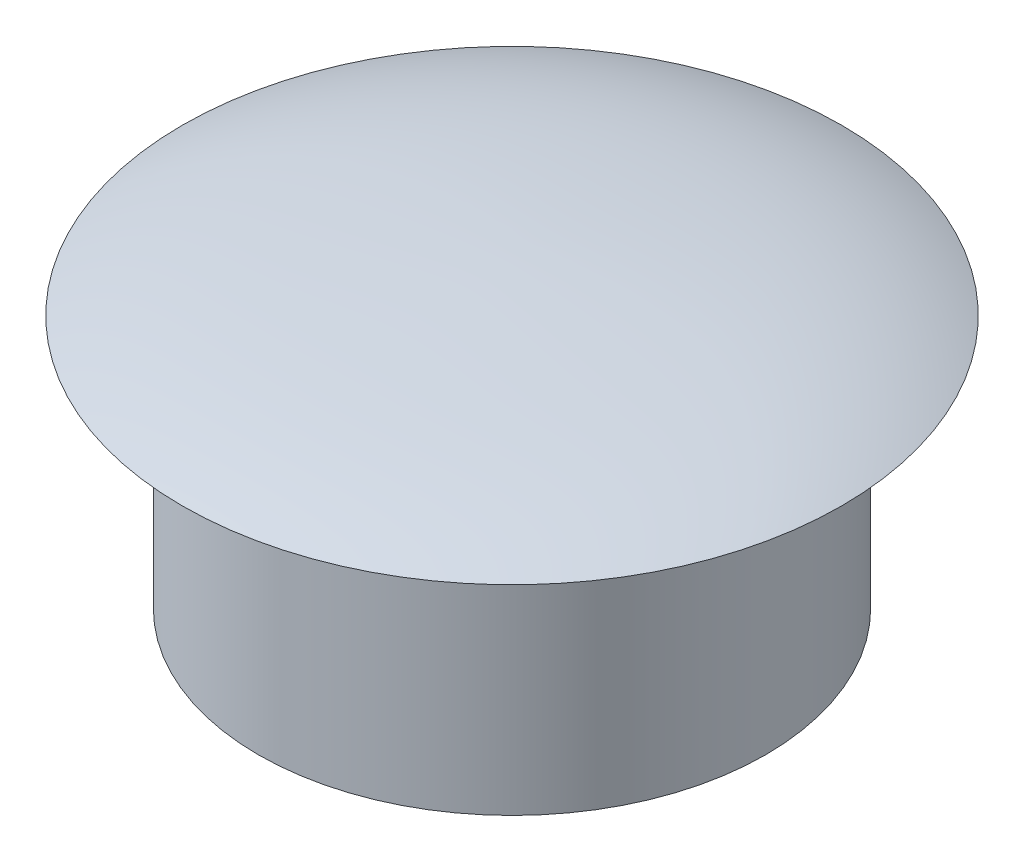
ISO-10303-21;
HEADER;
FILE_DESCRIPTION(('STEP AP214'),'2;1');
FILE_NAME('part.step','',(''),(''),'','','');
FILE_SCHEMA(('AUTOMOTIVE_DESIGN { 1 0 10303 214 1 1 1 1 }'));
ENDSEC;
DATA;
#1=APPLICATION_CONTEXT('core data for automotive mechanical design processes');
#2=APPLICATION_PROTOCOL_DEFINITION('international standard','automotive_design',2000,#1);
#3=PRODUCT_CONTEXT('',#1,'mechanical');
#4=PRODUCT('Part','Part','',(#3));
#5=PRODUCT_RELATED_PRODUCT_CATEGORY('part','',(#4));
#6=PRODUCT_DEFINITION_FORMATION('','',#4);
#7=PRODUCT_DEFINITION_CONTEXT('part definition',#1,'design');
#8=PRODUCT_DEFINITION('design','',#6,#7);
#9=PRODUCT_DEFINITION_SHAPE('','',#8);
#10=(LENGTH_UNIT() NAMED_UNIT(*) SI_UNIT(.MILLI.,.METRE.));
#11=(NAMED_UNIT(*) PLANE_ANGLE_UNIT() SI_UNIT($,.RADIAN.));
#12=(NAMED_UNIT(*) SI_UNIT($,.STERADIAN.) SOLID_ANGLE_UNIT());
#13=UNCERTAINTY_MEASURE_WITH_UNIT(LENGTH_MEASURE(1.E-05),#10,'distance_accuracy_value','');
#14=(GEOMETRIC_REPRESENTATION_CONTEXT(3) GLOBAL_UNCERTAINTY_ASSIGNED_CONTEXT((#13)) GLOBAL_UNIT_ASSIGNED_CONTEXT((#10,
#11,#12)) REPRESENTATION_CONTEXT('',''));
#15=CARTESIAN_POINT('',(0.,0.,0.));
#16=DIRECTION('',(0.,0.,1.));
#17=DIRECTION('',(1.,0.,0.));
#18=AXIS2_PLACEMENT_3D('',#15,#16,#17);
#19=CARTESIAN_POINT('',(-0.247747680903639,15.512478323168,0.));
#20=DIRECTION('',(0.,1.,0.));
#21=DIRECTION('',(-1.,0.,0.));
#22=AXIS2_PLACEMENT_3D('',#19,#20,#21);
#23=CYLINDRICAL_SURFACE('',#22,5.);
#24=CARTESIAN_POINT('',(-0.247747680903636,9.57512824739122,0.));
#25=DIRECTION('',(0.,1.,0.));
#26=DIRECTION('',(-1.,0.,0.));
#27=AXIS2_PLACEMENT_3D('',#24,#25,#26);
#28=CIRCLE('',#27,5.);
#29=CARTESIAN_POINT('',(-5.24774768090364,9.57512824739122,0.));
#30=VERTEX_POINT('',#29);
#31=EDGE_CURVE('E11',#30,#30,#28,.T.);
#32=ORIENTED_EDGE('',*,*,#31,.T.);
#33=EDGE_LOOP('',(#32));
#34=FACE_BOUND('',#33,.T.);
#35=CARTESIAN_POINT('',(-0.247747680903638,14.5751282473912,0.));
#36=DIRECTION('',(0.,1.,0.));
#37=DIRECTION('',(-1.,0.,0.));
#38=AXIS2_PLACEMENT_3D('',#35,#36,#37);
#39=CIRCLE('',#38,5.);
#40=CARTESIAN_POINT('',(-5.24774768090364,14.5751282473912,0.));
#41=VERTEX_POINT('',#40);
#42=EDGE_CURVE('E75',#41,#41,#39,.T.);
#43=ORIENTED_EDGE('',*,*,#42,.F.);
#44=EDGE_LOOP('',(#43));
#45=FACE_BOUND('',#44,.T.);
#46=ADVANCED_FACE('F36',(#34,#45),#23,.T.);
#47=CARTESIAN_POINT('',(-4.24774768090364,9.57512824739122,0.));
#48=DIRECTION('',(0.,-1.,0.));
#49=DIRECTION('',(1.,0.,0.));
#50=AXIS2_PLACEMENT_3D('',#47,#48,#49);
#51=PLANE('',#50);
#52=CARTESIAN_POINT('',(-0.247747680903636,9.57512824739122,0.));
#53=DIRECTION('',(0.,1.,0.));
#54=DIRECTION('',(-1.,0.,0.));
#55=AXIS2_PLACEMENT_3D('',#52,#53,#54);
#56=CIRCLE('',#55,4.);
#57=CARTESIAN_POINT('',(-4.24774768090364,9.57512824739122,0.));
#58=VERTEX_POINT('',#57);
#59=EDGE_CURVE('E43',#58,#58,#56,.T.);
#60=ORIENTED_EDGE('',*,*,#59,.T.);
#61=EDGE_LOOP('',(#60));
#62=FACE_BOUND('',#61,.T.);
#63=ORIENTED_EDGE('',*,*,#31,.F.);
#64=EDGE_LOOP('',(#63));
#65=FACE_BOUND('',#64,.T.);
#66=ADVANCED_FACE('F65',(#62,#65),#51,.T.);
#67=CARTESIAN_POINT('',(-0.247747680903639,15.512478323168,0.));
#68=DIRECTION('',(0.,1.,0.));
#69=DIRECTION('',(-1.,0.,0.));
#70=AXIS2_PLACEMENT_3D('',#67,#68,#69);
#71=CYLINDRICAL_SURFACE('',#70,4.);
#72=CARTESIAN_POINT('',(-0.247747680903638,14.5751282473912,0.));
#73=DIRECTION('',(0.,1.,0.));
#74=DIRECTION('',(-1.,0.,0.));
#75=AXIS2_PLACEMENT_3D('',#72,#73,#74);
#76=CIRCLE('',#75,4.);
#77=CARTESIAN_POINT('',(-4.24774768090364,14.5751282473912,0.));
#78=VERTEX_POINT('',#77);
#79=EDGE_CURVE('E81',#78,#78,#76,.T.);
#80=ORIENTED_EDGE('',*,*,#79,.T.);
#81=EDGE_LOOP('',(#80));
#82=FACE_BOUND('',#81,.T.);
#83=ORIENTED_EDGE('',*,*,#59,.F.);
#84=EDGE_LOOP('',(#83));
#85=FACE_BOUND('',#84,.T.);
#86=ADVANCED_FACE('F59',(#82,#85),#71,.F.);
#87=CARTESIAN_POINT('',(-4.24774768090364,14.5751282473912,0.));
#88=DIRECTION('',(0.,-1.,0.));
#89=DIRECTION('',(1.,0.,0.));
#90=AXIS2_PLACEMENT_3D('',#87,#88,#89);
#91=PLANE('',#90);
#92=ORIENTED_EDGE('',*,*,#79,.F.);
#93=EDGE_LOOP('',(#92));
#94=FACE_BOUND('',#93,.T.);
#95=ADVANCED_FACE('F50',(#94),#91,.T.);
#96=CARTESIAN_POINT('',(-0.247747680903638,15.512478323168,0.));
#97=CARTESIAN_POINT('',(-1.04331470575027,15.512478323168,0.));
#98=CARTESIAN_POINT('',(-3.60530592606721,15.3884254455035,0.));
#99=CARTESIAN_POINT('',(-5.65640244402275,15.0559998912562,0.));
#100=CARTESIAN_POINT('',(-6.74774768090364,14.5751282473912,0.));
#101=B_SPLINE_CURVE_WITH_KNOTS('',3,(#96,#97,#98,#99,#100),.UNSPECIFIED.,.F.,.F.,(4,1,4),(0.,
0.466481842377583,1.),.UNSPECIFIED.);
#102=CARTESIAN_POINT('',(-0.247747680903639,15.512478323168,0.));
#103=DIRECTION('',(0.,1.,0.));
#104=AXIS1_PLACEMENT('',#102,#103);
#105=SURFACE_OF_REVOLUTION('',#101,#104);
#106=CARTESIAN_POINT('',(-0.247747680903638,14.5751282473912,0.));
#107=DIRECTION('',(0.,1.,0.));
#108=DIRECTION('',(-1.,0.,0.));
#109=AXIS2_PLACEMENT_3D('',#106,#107,#108);
#110=CIRCLE('',#109,6.5);
#111=CARTESIAN_POINT('',(-6.74774768090364,14.5751282473912,0.));
#112=VERTEX_POINT('',#111);
#113=EDGE_CURVE('E77',#112,#112,#110,.T.);
#114=ORIENTED_EDGE('',*,*,#113,.T.);
#115=EDGE_LOOP('',(#114));
#116=FACE_BOUND('',#115,.T.);
#117=CARTESIAN_POINT('',(-0.247747680903639,15.512478323168,0.));
#118=VERTEX_POINT('',#117);
#119=VERTEX_LOOP('',#118);
#120=FACE_BOUND('',#119,.T.);
#121=ADVANCED_FACE('F47',(#116,#120),#105,.F.);
#122=CARTESIAN_POINT('',(-5.24774768090364,14.5751282473912,0.));
#123=DIRECTION('',(0.,-1.,0.));
#124=DIRECTION('',(1.,0.,0.));
#125=AXIS2_PLACEMENT_3D('',#122,#123,#124);
#126=PLANE('',#125);
#127=ORIENTED_EDGE('',*,*,#42,.T.);
#128=EDGE_LOOP('',(#127));
#129=FACE_BOUND('',#128,.T.);
#130=ORIENTED_EDGE('',*,*,#113,.F.);
#131=EDGE_LOOP('',(#130));
#132=FACE_BOUND('',#131,.T.);
#133=ADVANCED_FACE('F49',(#129,#132),#126,.T.);
#134=CLOSED_SHELL('',(#46,#66,#86,#95,#121,#133));
#135=MANIFOLD_SOLID_BREP('B2',#134);
#136=ADVANCED_BREP_SHAPE_REPRESENTATION('',(#18,#135),#14);
#137=SHAPE_DEFINITION_REPRESENTATION(#9,#136);
ENDSEC;
END-ISO-10303-21;
